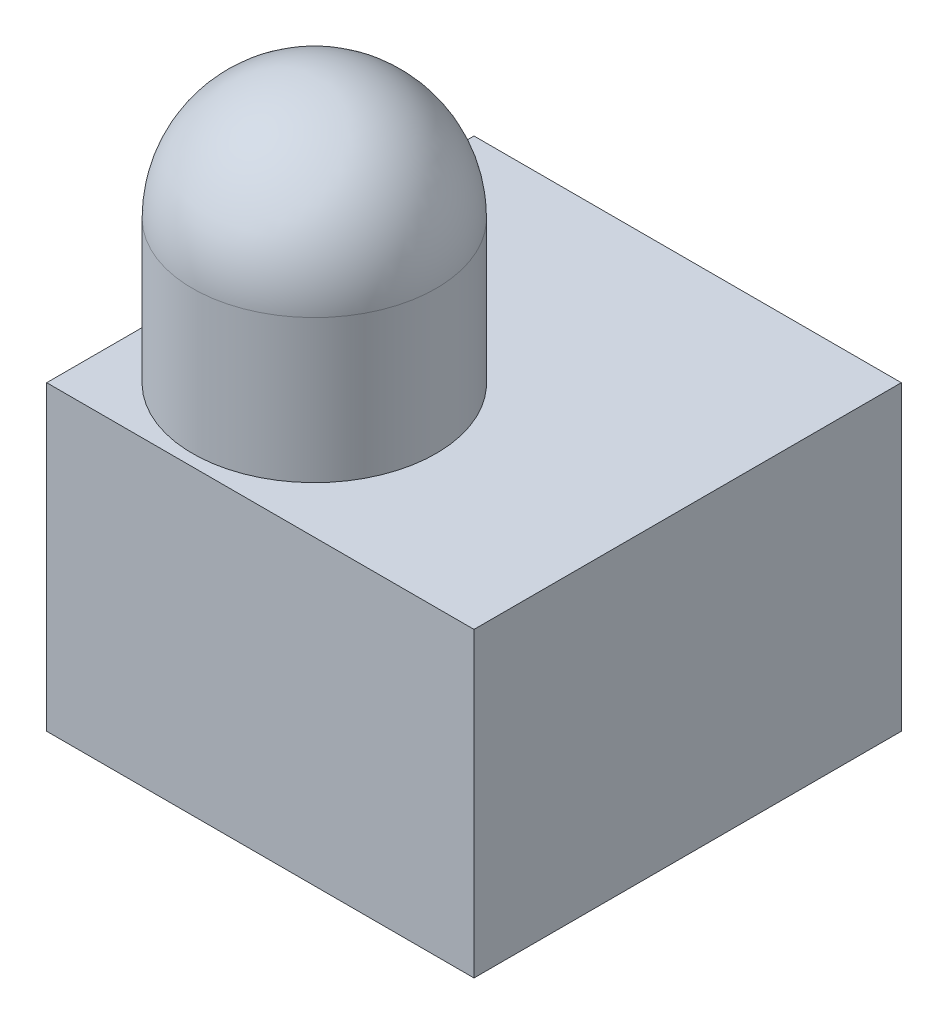
ISO-10303-21;
HEADER;
FILE_DESCRIPTION(('STEP AP214'),'2;1');
FILE_NAME('part.step','',(''),(''),'','','');
FILE_SCHEMA(('AUTOMOTIVE_DESIGN { 1 0 10303 214 1 1 1 1 }'));
ENDSEC;
DATA;
#1=APPLICATION_CONTEXT('core data for automotive mechanical design processes');
#2=APPLICATION_PROTOCOL_DEFINITION('international standard','automotive_design',2000,#1);
#3=PRODUCT_CONTEXT('',#1,'mechanical');
#4=PRODUCT('Part','Part','',(#3));
#5=PRODUCT_RELATED_PRODUCT_CATEGORY('part','',(#4));
#6=PRODUCT_DEFINITION_FORMATION('','',#4);
#7=PRODUCT_DEFINITION_CONTEXT('part definition',#1,'design');
#8=PRODUCT_DEFINITION('design','',#6,#7);
#9=PRODUCT_DEFINITION_SHAPE('','',#8);
#10=(LENGTH_UNIT() NAMED_UNIT(*) SI_UNIT(.MILLI.,.METRE.));
#11=(NAMED_UNIT(*) PLANE_ANGLE_UNIT() SI_UNIT($,.RADIAN.));
#12=(NAMED_UNIT(*) SI_UNIT($,.STERADIAN.) SOLID_ANGLE_UNIT());
#13=UNCERTAINTY_MEASURE_WITH_UNIT(LENGTH_MEASURE(1.E-05),#10,'distance_accuracy_value','');
#14=(GEOMETRIC_REPRESENTATION_CONTEXT(3) GLOBAL_UNCERTAINTY_ASSIGNED_CONTEXT((#13)) GLOBAL_UNIT_ASSIGNED_CONTEXT((#10,
#11,#12)) REPRESENTATION_CONTEXT('',''));
#15=CARTESIAN_POINT('',(0.,0.,0.));
#16=DIRECTION('',(0.,0.,1.));
#17=DIRECTION('',(1.,0.,0.));
#18=AXIS2_PLACEMENT_3D('',#15,#16,#17);
#19=CARTESIAN_POINT('',(-116.84,165.1,116.84));
#20=DIRECTION('',(1.,0.,0.));
#21=DIRECTION('',(0.,0.,-1.));
#22=AXIS2_PLACEMENT_3D('',#19,#20,#21);
#23=PLANE('',#22);
#24=DIRECTION('',(0.,0.,1.));
#25=VECTOR('',#24,1.);
#26=CARTESIAN_POINT('',(-116.84,0.,116.84));
#27=LINE('',#26,#25);
#28=CARTESIAN_POINT('',(-116.84,0.,-116.84));
#29=VERTEX_POINT('',#28);
#30=CARTESIAN_POINT('',(-116.84,0.,116.84));
#31=VERTEX_POINT('',#30);
#32=EDGE_CURVE('E119',#29,#31,#27,.T.);
#33=ORIENTED_EDGE('',*,*,#32,.T.);
#34=DIRECTION('',(0.,-1.,0.));
#35=VECTOR('',#34,1.);
#36=CARTESIAN_POINT('',(-116.84,165.1,116.84));
#37=LINE('',#36,#35);
#38=CARTESIAN_POINT('',(-116.84,165.1,116.84));
#39=VERTEX_POINT('',#38);
#40=EDGE_CURVE('E11',#39,#31,#37,.T.);
#41=ORIENTED_EDGE('',*,*,#40,.F.);
#42=DIRECTION('',(0.,0.,1.));
#43=VECTOR('',#42,1.);
#44=CARTESIAN_POINT('',(-116.84,165.1,116.84));
#45=LINE('',#44,#43);
#46=CARTESIAN_POINT('',(-116.84,165.1,-116.84));
#47=VERTEX_POINT('',#46);
#48=EDGE_CURVE('E103',#47,#39,#45,.T.);
#49=ORIENTED_EDGE('',*,*,#48,.F.);
#50=DIRECTION('',(0.,-1.,0.));
#51=VECTOR('',#50,1.);
#52=CARTESIAN_POINT('',(-116.84,165.1,-116.84));
#53=LINE('',#52,#51);
#54=EDGE_CURVE('E115',#47,#29,#53,.T.);
#55=ORIENTED_EDGE('',*,*,#54,.T.);
#56=EDGE_LOOP('',(#33,#41,#49,#55));
#57=FACE_BOUND('',#56,.T.);
#58=ADVANCED_FACE('F51',(#57),#23,.F.);
#59=CARTESIAN_POINT('',(116.84,165.1,116.84));
#60=DIRECTION('',(0.,0.,-1.));
#61=DIRECTION('',(-1.,0.,0.));
#62=AXIS2_PLACEMENT_3D('',#59,#60,#61);
#63=PLANE('',#62);
#64=DIRECTION('',(1.,0.,0.));
#65=VECTOR('',#64,1.);
#66=CARTESIAN_POINT('',(116.84,0.,116.84));
#67=LINE('',#66,#65);
#68=CARTESIAN_POINT('',(116.84,0.,116.84));
#69=VERTEX_POINT('',#68);
#70=EDGE_CURVE('E108',#31,#69,#67,.T.);
#71=ORIENTED_EDGE('',*,*,#70,.T.);
#72=DIRECTION('',(0.,-1.,0.));
#73=VECTOR('',#72,1.);
#74=CARTESIAN_POINT('',(116.84,165.1,116.84));
#75=LINE('',#74,#73);
#76=CARTESIAN_POINT('',(116.84,165.1,116.84));
#77=VERTEX_POINT('',#76);
#78=EDGE_CURVE('E60',#77,#69,#75,.T.);
#79=ORIENTED_EDGE('',*,*,#78,.F.);
#80=DIRECTION('',(1.,0.,0.));
#81=VECTOR('',#80,1.);
#82=CARTESIAN_POINT('',(116.84,165.1,116.84));
#83=LINE('',#82,#81);
#84=EDGE_CURVE('E98',#39,#77,#83,.T.);
#85=ORIENTED_EDGE('',*,*,#84,.F.);
#86=ORIENTED_EDGE('',*,*,#40,.T.);
#87=EDGE_LOOP('',(#71,#79,#85,#86));
#88=FACE_BOUND('',#87,.T.);
#89=ADVANCED_FACE('F107',(#88),#63,.F.);
#90=CARTESIAN_POINT('',(116.84,165.1,116.84));
#91=DIRECTION('',(-1.,0.,0.));
#92=DIRECTION('',(0.,0.,1.));
#93=AXIS2_PLACEMENT_3D('',#90,#91,#92);
#94=PLANE('',#93);
#95=DIRECTION('',(0.,0.,-1.));
#96=VECTOR('',#95,1.);
#97=CARTESIAN_POINT('',(116.84,0.,116.84));
#98=LINE('',#97,#96);
#99=CARTESIAN_POINT('',(116.84,0.,-116.84));
#100=VERTEX_POINT('',#99);
#101=EDGE_CURVE('E85',#69,#100,#98,.T.);
#102=ORIENTED_EDGE('',*,*,#101,.T.);
#103=DIRECTION('',(0.,-1.,0.));
#104=VECTOR('',#103,1.);
#105=CARTESIAN_POINT('',(116.84,165.1,-116.84));
#106=LINE('',#105,#104);
#107=CARTESIAN_POINT('',(116.84,165.1,-116.84));
#108=VERTEX_POINT('',#107);
#109=EDGE_CURVE('E110',#108,#100,#106,.T.);
#110=ORIENTED_EDGE('',*,*,#109,.F.);
#111=DIRECTION('',(0.,0.,-1.));
#112=VECTOR('',#111,1.);
#113=CARTESIAN_POINT('',(116.84,165.1,116.84));
#114=LINE('',#113,#112);
#115=EDGE_CURVE('E101',#77,#108,#114,.T.);
#116=ORIENTED_EDGE('',*,*,#115,.F.);
#117=ORIENTED_EDGE('',*,*,#78,.T.);
#118=EDGE_LOOP('',(#102,#110,#116,#117));
#119=FACE_BOUND('',#118,.T.);
#120=ADVANCED_FACE('F111',(#119),#94,.F.);
#121=CARTESIAN_POINT('',(116.84,165.1,-116.84));
#122=DIRECTION('',(0.,0.,1.));
#123=DIRECTION('',(1.,0.,0.));
#124=AXIS2_PLACEMENT_3D('',#121,#122,#123);
#125=PLANE('',#124);
#126=DIRECTION('',(-1.,0.,0.));
#127=VECTOR('',#126,1.);
#128=CARTESIAN_POINT('',(116.84,0.,-116.84));
#129=LINE('',#128,#127);
#130=EDGE_CURVE('E91',#100,#29,#129,.T.);
#131=ORIENTED_EDGE('',*,*,#130,.T.);
#132=ORIENTED_EDGE('',*,*,#54,.F.);
#133=DIRECTION('',(-1.,0.,0.));
#134=VECTOR('',#133,1.);
#135=CARTESIAN_POINT('',(116.84,165.1,-116.84));
#136=LINE('',#135,#134);
#137=EDGE_CURVE('E68',#108,#47,#136,.T.);
#138=ORIENTED_EDGE('',*,*,#137,.F.);
#139=ORIENTED_EDGE('',*,*,#109,.T.);
#140=EDGE_LOOP('',(#131,#132,#138,#139));
#141=FACE_BOUND('',#140,.T.);
#142=ADVANCED_FACE('F133',(#141),#125,.F.);
#143=CARTESIAN_POINT('',(0.,165.1,0.));
#144=DIRECTION('',(0.,1.,0.));
#145=DIRECTION('',(0.,0.,1.));
#146=AXIS2_PLACEMENT_3D('',#143,#144,#145);
#147=PLANE('',#146);
#148=CARTESIAN_POINT('',(-43.4094629102831,165.1,43.9169685858463));
#149=DIRECTION('',(0.,-1.,0.));
#150=DIRECTION('',(0.,0.,-1.));
#151=AXIS2_PLACEMENT_3D('',#148,#149,#150);
#152=CIRCLE('',#151,66.6142163607045);
#153=CARTESIAN_POINT('',(-43.4094629102831,165.1,-22.6972477748582));
#154=VERTEX_POINT('',#153);
#155=EDGE_CURVE('E123',#154,#154,#152,.T.);
#156=ORIENTED_EDGE('',*,*,#155,.T.);
#157=EDGE_LOOP('',(#156));
#158=FACE_BOUND('',#157,.T.);
#159=ORIENTED_EDGE('',*,*,#48,.T.);
#160=ORIENTED_EDGE('',*,*,#84,.T.);
#161=ORIENTED_EDGE('',*,*,#115,.T.);
#162=ORIENTED_EDGE('',*,*,#137,.T.);
#163=EDGE_LOOP('',(#159,#160,#161,#162));
#164=FACE_BOUND('',#163,.T.);
#165=ADVANCED_FACE('F99',(#158,#164),#147,.T.);
#166=CARTESIAN_POINT('',(0.,0.,0.));
#167=DIRECTION('',(0.,1.,0.));
#168=DIRECTION('',(0.,0.,1.));
#169=AXIS2_PLACEMENT_3D('',#166,#167,#168);
#170=PLANE('',#169);
#171=ORIENTED_EDGE('',*,*,#32,.F.);
#172=ORIENTED_EDGE('',*,*,#130,.F.);
#173=ORIENTED_EDGE('',*,*,#101,.F.);
#174=ORIENTED_EDGE('',*,*,#70,.F.);
#175=EDGE_LOOP('',(#171,#172,#173,#174));
#176=FACE_BOUND('',#175,.T.);
#177=ADVANCED_FACE('F136',(#176),#170,.F.);
#178=CARTESIAN_POINT('',(-43.4094629102831,165.1,43.9169685858463));
#179=DIRECTION('',(0.,-1.,0.));
#180=DIRECTION('',(0.,0.,-1.));
#181=AXIS2_PLACEMENT_3D('',#178,#179,#180);
#182=CYLINDRICAL_SURFACE('',#181,66.6142163607045);
#183=CARTESIAN_POINT('',(-43.4094629102831,243.269235707864,43.9169685858463));
#184=DIRECTION('',(0.,-1.,0.));
#185=DIRECTION('',(0.,0.,-1.));
#186=AXIS2_PLACEMENT_3D('',#183,#184,#185);
#187=CIRCLE('',#186,66.6142163607045);
#188=CARTESIAN_POINT('',(-43.4094629102831,243.269235707864,-22.6972477748582));
#189=VERTEX_POINT('',#188);
#190=EDGE_CURVE('E143',#189,#189,#187,.T.);
#191=ORIENTED_EDGE('',*,*,#190,.T.);
#192=EDGE_LOOP('',(#191));
#193=FACE_BOUND('',#192,.T.);
#194=ORIENTED_EDGE('',*,*,#155,.F.);
#195=EDGE_LOOP('',(#194));
#196=FACE_BOUND('',#195,.T.);
#197=ADVANCED_FACE('F148',(#193,#196),#182,.T.);
#198=CARTESIAN_POINT('',(-43.4094629102831,243.269235707864,43.9169685858463));
#199=DIRECTION('',(0.,-1.,0.));
#200=DIRECTION('',(0.,0.,-1.));
#201=AXIS2_PLACEMENT_3D('',#198,#199,#200);
#202=SPHERICAL_SURFACE('',#201,66.6142163607045);
#203=ORIENTED_EDGE('',*,*,#190,.F.);
#204=EDGE_LOOP('',(#203));
#205=FACE_BOUND('',#204,.T.);
#206=ADVANCED_FACE('F151',(#205),#202,.T.);
#207=CLOSED_SHELL('',(#58,#89,#120,#142,#165,#177,#197,#206));
#208=MANIFOLD_SOLID_BREP('B2',#207);
#209=ADVANCED_BREP_SHAPE_REPRESENTATION('',(#18,#208),#14);
#210=SHAPE_DEFINITION_REPRESENTATION(#9,#209);
ENDSEC;
END-ISO-10303-21;
